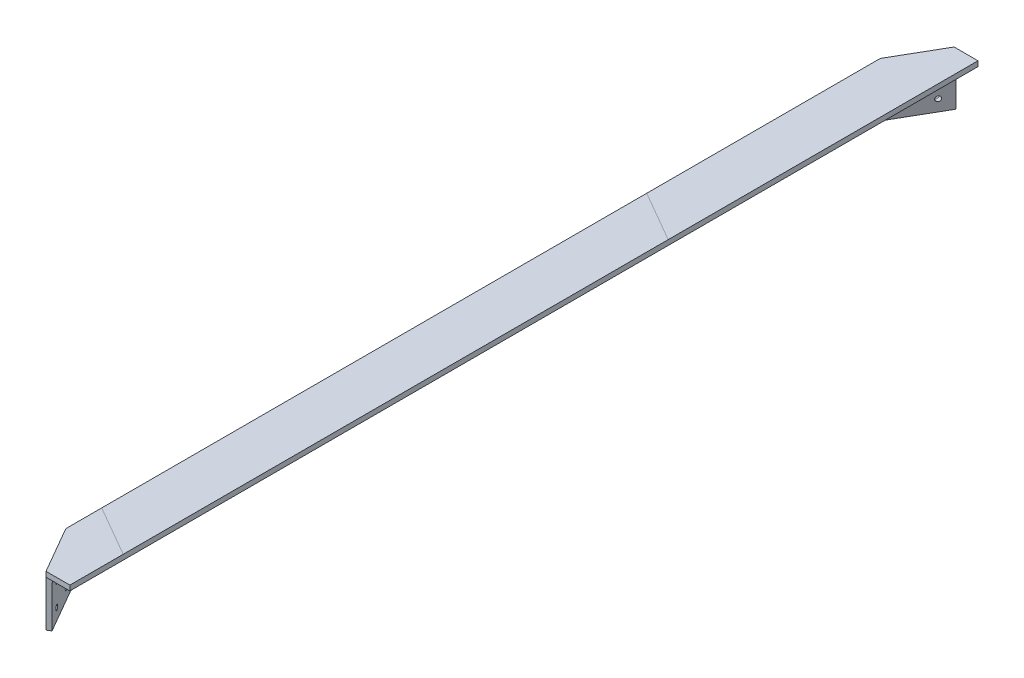
ISO-10303-21;
HEADER;
FILE_DESCRIPTION(('STEP AP214'),'2;1');
FILE_NAME('part.step','',(''),(''),'','','');
FILE_SCHEMA(('AUTOMOTIVE_DESIGN { 1 0 10303 214 1 1 1 1 }'));
ENDSEC;
DATA;
#1=APPLICATION_CONTEXT('core data for automotive mechanical design processes');
#2=APPLICATION_PROTOCOL_DEFINITION('international standard','automotive_design',2000,#1);
#3=PRODUCT_CONTEXT('',#1,'mechanical');
#4=PRODUCT('Part','Part','',(#3));
#5=PRODUCT_RELATED_PRODUCT_CATEGORY('part','',(#4));
#6=PRODUCT_DEFINITION_FORMATION('','',#4);
#7=PRODUCT_DEFINITION_CONTEXT('part definition',#1,'design');
#8=PRODUCT_DEFINITION('design','',#6,#7);
#9=PRODUCT_DEFINITION_SHAPE('','',#8);
#10=(LENGTH_UNIT() NAMED_UNIT(*) SI_UNIT(.MILLI.,.METRE.));
#11=(NAMED_UNIT(*) PLANE_ANGLE_UNIT() SI_UNIT($,.RADIAN.));
#12=(NAMED_UNIT(*) SI_UNIT($,.STERADIAN.) SOLID_ANGLE_UNIT());
#13=UNCERTAINTY_MEASURE_WITH_UNIT(LENGTH_MEASURE(1.E-05),#10,'distance_accuracy_value','');
#14=(GEOMETRIC_REPRESENTATION_CONTEXT(3) GLOBAL_UNCERTAINTY_ASSIGNED_CONTEXT((#13)) GLOBAL_UNIT_ASSIGNED_CONTEXT((#10,
#11,#12)) REPRESENTATION_CONTEXT('',''));
#15=CARTESIAN_POINT('',(0.,0.,0.));
#16=DIRECTION('',(0.,0.,1.));
#17=DIRECTION('',(1.,0.,0.));
#18=AXIS2_PLACEMENT_3D('',#15,#16,#17);
#19=CARTESIAN_POINT('',(-7.99999999999999,8.00000000000001,640.));
#20=DIRECTION('',(0.,-1.,0.));
#21=DIRECTION('',(1.,0.,0.));
#22=AXIS2_PLACEMENT_3D('',#19,#20,#21);
#23=PLANE('',#22);
#24=DIRECTION('',(-0.866025403784436,0.,-0.500000000000005));
#25=VECTOR('',#24,1.);
#26=CARTESIAN_POINT('',(387.319024505817,8.00000000000002,-44.7126356426317));
#27=LINE('',#26,#25);
#28=CARTESIAN_POINT('',(72.,8.00000000000001,-226.762159321677));
#29=VERTEX_POINT('',#28);
#30=CARTESIAN_POINT('',(-7.99999999999999,8.00000000000001,-272.950180856848));
#31=VERTEX_POINT('',#30);
#32=EDGE_CURVE('E11',#29,#31,#27,.T.);
#33=ORIENTED_EDGE('',*,*,#32,.F.);
#34=DIRECTION('',(0.,0.,-1.));
#35=VECTOR('',#34,1.);
#36=CARTESIAN_POINT('',(72.,8.00000000000001,640.));
#37=LINE('',#36,#35);
#38=CARTESIAN_POINT('',(72.,8.,-713.612159321677));
#39=VERTEX_POINT('',#38);
#40=EDGE_CURVE('E289',#29,#39,#37,.T.);
#41=ORIENTED_EDGE('',*,*,#40,.T.);
#42=DIRECTION('',(1.,0.,0.));
#43=VECTOR('',#42,1.);
#44=CARTESIAN_POINT('',(34.4999999999996,8.,-713.612159321677));
#45=LINE('',#44,#43);
#46=CARTESIAN_POINT('',(34.4999999999996,8.,-713.612159321677));
#47=VERTEX_POINT('',#46);
#48=EDGE_CURVE('E219',#47,#39,#45,.T.);
#49=ORIENTED_EDGE('',*,*,#48,.F.);
#50=DIRECTION('',(0.499999999999995,0.,-0.866025403784441));
#51=VECTOR('',#50,1.);
#52=CARTESIAN_POINT('',(-7.99999999999999,8.,-640.));
#53=LINE('',#52,#51);
#54=CARTESIAN_POINT('',(-6.66025403784448,8.,-642.320508075689));
#55=VERTEX_POINT('',#54);
#56=EDGE_CURVE('E222',#55,#47,#53,.T.);
#57=ORIENTED_EDGE('',*,*,#56,.F.);
#58=CARTESIAN_POINT('',(2.00000000000001,8.00000000000001,-637.320508075689));
#59=DIRECTION('',(0.,-1.,0.));
#60=DIRECTION('',(1.,0.,0.));
#61=AXIS2_PLACEMENT_3D('',#58,#59,#60);
#62=CIRCLE('',#61,10.);
#63=CARTESIAN_POINT('',(-7.99999999999999,8.00000000000001,-637.320508075689));
#64=VERTEX_POINT('',#63);
#65=EDGE_CURVE('E346',#55,#64,#62,.F.);
#66=ORIENTED_EDGE('',*,*,#65,.T.);
#67=DIRECTION('',(0.,0.,-1.));
#68=VECTOR('',#67,1.);
#69=CARTESIAN_POINT('',(-7.99999999999999,8.00000000000001,640.));
#70=LINE('',#69,#68);
#71=EDGE_CURVE('E285',#31,#64,#70,.T.);
#72=ORIENTED_EDGE('',*,*,#71,.F.);
#73=EDGE_LOOP('',(#33,#41,#49,#57,#66,#72));
#74=FACE_BOUND('',#73,.T.);
#75=ADVANCED_FACE('F43',(#74),#23,.F.);
#76=DIRECTION('',(0.866025403784436,0.,0.500000000000005));
#77=VECTOR('',#76,1.);
#78=CARTESIAN_POINT('',(16.4331150536629,8.00000000000001,597.68060333988));
#79=LINE('',#78,#77);
#80=CARTESIAN_POINT('',(-8.00000000000001,8.00000000000001,583.574137786507));
#81=VERTEX_POINT('',#80);
#82=CARTESIAN_POINT('',(72.,8.00000000000001,629.762159321678));
#83=VERTEX_POINT('',#82);
#84=EDGE_CURVE('E52',#81,#83,#79,.T.);
#85=ORIENTED_EDGE('',*,*,#84,.F.);
#86=CARTESIAN_POINT('',(-7.99999999999999,8.00000000000001,637.320508075689));
#87=VERTEX_POINT('',#86);
#88=EDGE_CURVE('E286',#87,#81,#70,.T.);
#89=ORIENTED_EDGE('',*,*,#88,.F.);
#90=CARTESIAN_POINT('',(2.00000000000001,8.00000000000001,637.320508075689));
#91=DIRECTION('',(0.,-1.,0.));
#92=DIRECTION('',(1.,0.,0.));
#93=AXIS2_PLACEMENT_3D('',#90,#91,#92);
#94=CIRCLE('',#93,10.);
#95=CARTESIAN_POINT('',(-6.66025403784442,8.,642.320508075689));
#96=VERTEX_POINT('',#95);
#97=EDGE_CURVE('E309',#87,#96,#94,.F.);
#98=ORIENTED_EDGE('',*,*,#97,.T.);
#99=DIRECTION('',(0.499999999999995,0.,0.866025403784441));
#100=VECTOR('',#99,1.);
#101=CARTESIAN_POINT('',(-7.99999999999999,8.,640.));
#102=LINE('',#101,#100);
#103=CARTESIAN_POINT('',(34.4999999999996,8.,713.612159321677));
#104=VERTEX_POINT('',#103);
#105=EDGE_CURVE('E272',#96,#104,#102,.T.);
#106=ORIENTED_EDGE('',*,*,#105,.T.);
#107=DIRECTION('',(1.,0.,0.));
#108=VECTOR('',#107,1.);
#109=CARTESIAN_POINT('',(34.4999999999996,8.,713.612159321677));
#110=LINE('',#109,#108);
#111=CARTESIAN_POINT('',(72.,8.,713.612159321677));
#112=VERTEX_POINT('',#111);
#113=EDGE_CURVE('E274',#104,#112,#110,.T.);
#114=ORIENTED_EDGE('',*,*,#113,.T.);
#115=EDGE_CURVE('E291',#112,#83,#37,.T.);
#116=ORIENTED_EDGE('',*,*,#115,.T.);
#117=EDGE_LOOP('',(#85,#89,#98,#106,#114,#116));
#118=FACE_BOUND('',#117,.T.);
#119=ADVANCED_FACE('F431',(#118),#23,.F.);
#120=CARTESIAN_POINT('',(72.,0.,640.));
#121=DIRECTION('',(0.,1.,0.));
#122=DIRECTION('',(-1.,0.,0.));
#123=AXIS2_PLACEMENT_3D('',#120,#121,#122);
#124=PLANE('',#123);
#125=DIRECTION('',(0.,0.,-1.));
#126=VECTOR('',#125,1.);
#127=CARTESIAN_POINT('',(8.00000000000001,0.,0.));
#128=LINE('',#127,#126);
#129=CARTESIAN_POINT('',(8.,0.,637.320508075689));
#130=VERTEX_POINT('',#129);
#131=CARTESIAN_POINT('',(8.00000000000001,0.,0.));
#132=VERTEX_POINT('',#131);
#133=EDGE_CURVE('E322',#130,#132,#128,.T.);
#134=ORIENTED_EDGE('',*,*,#133,.T.);
#135=DIRECTION('',(0.,0.,1.));
#136=VECTOR('',#135,1.);
#137=CARTESIAN_POINT('',(8.,0.,-637.320508075689));
#138=LINE('',#137,#136);
#139=CARTESIAN_POINT('',(8.,0.,-637.320508075689));
#140=VERTEX_POINT('',#139);
#141=EDGE_CURVE('E364',#132,#140,#138,.F.);
#142=ORIENTED_EDGE('',*,*,#141,.T.);
#143=CARTESIAN_POINT('',(10.,0.,-637.320508075689));
#144=DIRECTION('',(0.,1.,0.));
#145=DIRECTION('',(-1.,0.,0.));
#146=AXIS2_PLACEMENT_3D('',#143,#144,#145);
#147=CIRCLE('',#146,2.);
#148=CARTESIAN_POINT('',(8.26794919243096,0.,-638.320508075689));
#149=VERTEX_POINT('',#148);
#150=EDGE_CURVE('E362',#140,#149,#147,.F.);
#151=ORIENTED_EDGE('',*,*,#150,.T.);
#152=DIRECTION('',(0.499999999999996,0.,-0.866025403784441));
#153=VECTOR('',#152,1.);
#154=CARTESIAN_POINT('',(-529.328055191762,0.,292.823085463766));
#155=LINE('',#154,#153);
#156=CARTESIAN_POINT('',(47.4282032302751,0.,-706.14805770654));
#157=VERTEX_POINT('',#156);
#158=EDGE_CURVE('E359',#149,#157,#155,.T.);
#159=ORIENTED_EDGE('',*,*,#158,.T.);
#160=DIRECTION('',(-0.866025403784439,0.,-0.5));
#161=VECTOR('',#160,1.);
#162=CARTESIAN_POINT('',(34.4999999999996,0.,-713.612159321677));
#163=LINE('',#162,#161);
#164=CARTESIAN_POINT('',(34.4999999999996,0.,-713.612159321677));
#165=VERTEX_POINT('',#164);
#166=EDGE_CURVE('E206',#157,#165,#163,.T.);
#167=ORIENTED_EDGE('',*,*,#166,.T.);
#168=DIRECTION('',(1.,0.,0.));
#169=VECTOR('',#168,1.);
#170=CARTESIAN_POINT('',(34.4999999999996,0.,-713.612159321677));
#171=LINE('',#170,#169);
#172=CARTESIAN_POINT('',(72.,0.,-713.612159321677));
#173=VERTEX_POINT('',#172);
#174=EDGE_CURVE('E196',#165,#173,#171,.T.);
#175=ORIENTED_EDGE('',*,*,#174,.T.);
#176=DIRECTION('',(0.,0.,-1.));
#177=VECTOR('',#176,1.);
#178=CARTESIAN_POINT('',(72.,0.,640.));
#179=LINE('',#178,#177);
#180=CARTESIAN_POINT('',(72.,0.,713.612159321677));
#181=VERTEX_POINT('',#180);
#182=EDGE_CURVE('E294',#181,#173,#179,.T.);
#183=ORIENTED_EDGE('',*,*,#182,.F.);
#184=DIRECTION('',(1.,0.,0.));
#185=VECTOR('',#184,1.);
#186=CARTESIAN_POINT('',(34.4999999999996,0.,713.612159321677));
#187=LINE('',#186,#185);
#188=CARTESIAN_POINT('',(34.4999999999996,0.,713.612159321677));
#189=VERTEX_POINT('',#188);
#190=EDGE_CURVE('E271',#189,#181,#187,.T.);
#191=ORIENTED_EDGE('',*,*,#190,.F.);
#192=DIRECTION('',(-0.866025403784439,0.,0.5));
#193=VECTOR('',#192,1.);
#194=CARTESIAN_POINT('',(34.4999999999996,0.,713.612159321677));
#195=LINE('',#194,#193);
#196=CARTESIAN_POINT('',(47.4282032302752,0.,706.14805770654));
#197=VERTEX_POINT('',#196);
#198=EDGE_CURVE('E256',#197,#189,#195,.T.);
#199=ORIENTED_EDGE('',*,*,#198,.F.);
#200=DIRECTION('',(0.499999999999996,0.,0.866025403784441));
#201=VECTOR('',#200,1.);
#202=CARTESIAN_POINT('',(8.26794919243111,0.,638.320508075689));
#203=LINE('',#202,#201);
#204=CARTESIAN_POINT('',(8.26794919243111,0.,638.320508075689));
#205=VERTEX_POINT('',#204);
#206=EDGE_CURVE('E318',#197,#205,#203,.F.);
#207=ORIENTED_EDGE('',*,*,#206,.T.);
#208=CARTESIAN_POINT('',(10.,0.,637.320508075689));
#209=DIRECTION('',(0.,1.,0.));
#210=DIRECTION('',(-1.,0.,0.));
#211=AXIS2_PLACEMENT_3D('',#208,#209,#210);
#212=CIRCLE('',#211,2.);
#213=EDGE_CURVE('E320',#205,#130,#212,.F.);
#214=ORIENTED_EDGE('',*,*,#213,.T.);
#215=EDGE_LOOP('',(#134,#142,#151,#159,#167,#175,#183,#191,#199,#207,#214));
#216=FACE_BOUND('',#215,.T.);
#217=ADVANCED_FACE('F438',(#216),#124,.F.);
#218=CARTESIAN_POINT('',(-8.,-72.,640.));
#219=DIRECTION('',(1.,0.,0.));
#220=DIRECTION('',(0.,1.,0.));
#221=AXIS2_PLACEMENT_3D('',#218,#219,#220);
#222=PLANE('',#221);
#223=ORIENTED_EDGE('',*,*,#88,.T.);
#224=EDGE_CURVE('E290',#81,#31,#70,.T.);
#225=ORIENTED_EDGE('',*,*,#224,.T.);
#226=ORIENTED_EDGE('',*,*,#71,.T.);
#227=DIRECTION('',(0.,-1.,0.));
#228=VECTOR('',#227,1.);
#229=CARTESIAN_POINT('',(-8.,-72.,-637.320508075689));
#230=LINE('',#229,#228);
#231=CARTESIAN_POINT('',(-8.,-72.,-637.320508075689));
#232=VERTEX_POINT('',#231);
#233=EDGE_CURVE('E336',#64,#232,#230,.T.);
#234=ORIENTED_EDGE('',*,*,#233,.T.);
#235=DIRECTION('',(0.,0.,-1.));
#236=VECTOR('',#235,1.);
#237=CARTESIAN_POINT('',(-8.,-72.,640.));
#238=LINE('',#237,#236);
#239=CARTESIAN_POINT('',(-8.,-72.,637.320508075689));
#240=VERTEX_POINT('',#239);
#241=EDGE_CURVE('E300',#240,#232,#238,.T.);
#242=ORIENTED_EDGE('',*,*,#241,.F.);
#243=DIRECTION('',(0.,-1.,0.));
#244=VECTOR('',#243,1.);
#245=CARTESIAN_POINT('',(-8.,-72.,637.320508075689));
#246=LINE('',#245,#244);
#247=EDGE_CURVE('E307',#240,#87,#246,.F.);
#248=ORIENTED_EDGE('',*,*,#247,.T.);
#249=EDGE_LOOP('',(#223,#225,#226,#234,#242,#248));
#250=FACE_BOUND('',#249,.T.);
#251=ADVANCED_FACE('F514',(#250),#222,.F.);
#252=CARTESIAN_POINT('',(0.,-72.,640.));
#253=DIRECTION('',(0.,1.,0.));
#254=DIRECTION('',(0.,0.,1.));
#255=AXIS2_PLACEMENT_3D('',#252,#253,#254);
#256=PLANE('',#255);
#257=ORIENTED_EDGE('',*,*,#241,.T.);
#258=CARTESIAN_POINT('',(2.,-72.,-637.320508075689));
#259=DIRECTION('',(0.,1.,0.));
#260=DIRECTION('',(0.,0.,1.));
#261=AXIS2_PLACEMENT_3D('',#258,#259,#260);
#262=CIRCLE('',#261,10.);
#263=CARTESIAN_POINT('',(-6.66025403784449,-72.,-642.320508075689));
#264=VERTEX_POINT('',#263);
#265=EDGE_CURVE('E205',#232,#264,#262,.F.);
#266=ORIENTED_EDGE('',*,*,#265,.T.);
#267=DIRECTION('',(-0.499999999999996,0.,0.866025403784441));
#268=VECTOR('',#267,1.);
#269=CARTESIAN_POINT('',(-8.,-72.,-640.));
#270=LINE('',#269,#268);
#271=CARTESIAN_POINT('',(34.4999999999996,-72.,-713.612159321677));
#272=VERTEX_POINT('',#271);
#273=EDGE_CURVE('E189',#272,#264,#270,.T.);
#274=ORIENTED_EDGE('',*,*,#273,.F.);
#275=DIRECTION('',(-0.866025403784439,0.,-0.5));
#276=VECTOR('',#275,1.);
#277=CARTESIAN_POINT('',(34.4999999999996,-72.,-713.612159321677));
#278=LINE('',#277,#276);
#279=CARTESIAN_POINT('',(40.4999999999997,-72.,-710.14805770654));
#280=VERTEX_POINT('',#279);
#281=EDGE_CURVE('E204',#280,#272,#278,.T.);
#282=ORIENTED_EDGE('',*,*,#281,.F.);
#283=DIRECTION('',(0.499999999999996,0.,-0.866025403784441));
#284=VECTOR('',#283,1.);
#285=CARTESIAN_POINT('',(40.4999999999997,-72.,-710.14805770654));
#286=LINE('',#285,#284);
#287=CARTESIAN_POINT('',(1.33974596215551,-72.,-642.320508075689));
#288=VERTEX_POINT('',#287);
#289=EDGE_CURVE('E211',#288,#280,#286,.T.);
#290=ORIENTED_EDGE('',*,*,#289,.F.);
#291=CARTESIAN_POINT('',(10.,-72.,-637.320508075689));
#292=DIRECTION('',(0.,1.,0.));
#293=DIRECTION('',(0.,0.,1.));
#294=AXIS2_PLACEMENT_3D('',#291,#292,#293);
#295=CIRCLE('',#294,10.);
#296=CARTESIAN_POINT('',(0.,-72.,-637.320508075689));
#297=VERTEX_POINT('',#296);
#298=EDGE_CURVE('E354',#288,#297,#295,.T.);
#299=ORIENTED_EDGE('',*,*,#298,.T.);
#300=DIRECTION('',(0.,0.,-1.));
#301=VECTOR('',#300,1.);
#302=CARTESIAN_POINT('',(0.,-72.,640.));
#303=LINE('',#302,#301);
#304=CARTESIAN_POINT('',(0.,-72.,637.320508075689));
#305=VERTEX_POINT('',#304);
#306=EDGE_CURVE('E297',#305,#297,#303,.T.);
#307=ORIENTED_EDGE('',*,*,#306,.F.);
#308=CARTESIAN_POINT('',(10.,-72.,637.320508075689));
#309=DIRECTION('',(0.,1.,0.));
#310=DIRECTION('',(0.,0.,1.));
#311=AXIS2_PLACEMENT_3D('',#308,#309,#310);
#312=CIRCLE('',#311,10.);
#313=CARTESIAN_POINT('',(1.33974596215557,-72.,642.320508075689));
#314=VERTEX_POINT('',#313);
#315=EDGE_CURVE('E316',#305,#314,#312,.T.);
#316=ORIENTED_EDGE('',*,*,#315,.T.);
#317=DIRECTION('',(0.499999999999996,0.,0.866025403784441));
#318=VECTOR('',#317,1.);
#319=CARTESIAN_POINT('',(40.4999999999997,-72.,710.14805770654));
#320=LINE('',#319,#318);
#321=CARTESIAN_POINT('',(40.4999999999997,-72.,710.14805770654));
#322=VERTEX_POINT('',#321);
#323=EDGE_CURVE('E257',#314,#322,#320,.T.);
#324=ORIENTED_EDGE('',*,*,#323,.T.);
#325=DIRECTION('',(-0.866025403784439,0.,0.5));
#326=VECTOR('',#325,1.);
#327=CARTESIAN_POINT('',(34.4999999999996,-72.,713.612159321677));
#328=LINE('',#327,#326);
#329=CARTESIAN_POINT('',(34.4999999999996,-72.,713.612159321677));
#330=VERTEX_POINT('',#329);
#331=EDGE_CURVE('E259',#322,#330,#328,.T.);
#332=ORIENTED_EDGE('',*,*,#331,.T.);
#333=DIRECTION('',(-0.499999999999996,0.,-0.866025403784441));
#334=VECTOR('',#333,1.);
#335=CARTESIAN_POINT('',(-8.,-72.,640.));
#336=LINE('',#335,#334);
#337=CARTESIAN_POINT('',(-6.66025403784442,-72.,642.320508075689));
#338=VERTEX_POINT('',#337);
#339=EDGE_CURVE('E261',#330,#338,#336,.T.);
#340=ORIENTED_EDGE('',*,*,#339,.T.);
#341=CARTESIAN_POINT('',(2.,-72.,637.320508075689));
#342=DIRECTION('',(0.,1.,0.));
#343=DIRECTION('',(0.,0.,1.));
#344=AXIS2_PLACEMENT_3D('',#341,#342,#343);
#345=CIRCLE('',#344,10.);
#346=EDGE_CURVE('E305',#338,#240,#345,.F.);
#347=ORIENTED_EDGE('',*,*,#346,.T.);
#348=EDGE_LOOP('',(#257,#266,#274,#282,#290,#299,#307,#316,#324,#332,#340,#347));
#349=FACE_BOUND('',#348,.T.);
#350=ADVANCED_FACE('F202',(#349),#256,.F.);
#351=CARTESIAN_POINT('',(0.,0.,640.));
#352=DIRECTION('',(-1.,0.,0.));
#353=DIRECTION('',(0.,-1.,0.));
#354=AXIS2_PLACEMENT_3D('',#351,#352,#353);
#355=PLANE('',#354);
#356=DIRECTION('',(0.,1.,0.));
#357=VECTOR('',#356,1.);
#358=CARTESIAN_POINT('',(0.,0.,-637.320508075689));
#359=LINE('',#358,#357);
#360=CARTESIAN_POINT('',(0.,-8.,-637.320508075689));
#361=VERTEX_POINT('',#360);
#362=EDGE_CURVE('E349',#297,#361,#359,.T.);
#363=ORIENTED_EDGE('',*,*,#362,.T.);
#364=DIRECTION('',(0.,0.,1.));
#365=VECTOR('',#364,1.);
#366=CARTESIAN_POINT('',(0.,-8.,0.));
#367=LINE('',#366,#365);
#368=CARTESIAN_POINT('',(0.,-8.,0.));
#369=VERTEX_POINT('',#368);
#370=EDGE_CURVE('E356',#361,#369,#367,.T.);
#371=ORIENTED_EDGE('',*,*,#370,.T.);
#372=DIRECTION('',(0.,0.,-1.));
#373=VECTOR('',#372,1.);
#374=CARTESIAN_POINT('',(0.,-8.,637.320508075689));
#375=LINE('',#374,#373);
#376=CARTESIAN_POINT('',(0.,-8.00000000000001,637.320508075689));
#377=VERTEX_POINT('',#376);
#378=EDGE_CURVE('E325',#369,#377,#375,.F.);
#379=ORIENTED_EDGE('',*,*,#378,.T.);
#380=DIRECTION('',(0.,1.,0.));
#381=VECTOR('',#380,1.);
#382=CARTESIAN_POINT('',(0.,-72.,637.320508075689));
#383=LINE('',#382,#381);
#384=EDGE_CURVE('E314',#377,#305,#383,.F.);
#385=ORIENTED_EDGE('',*,*,#384,.T.);
#386=ORIENTED_EDGE('',*,*,#306,.T.);
#387=EDGE_LOOP('',(#363,#371,#379,#385,#386));
#388=FACE_BOUND('',#387,.T.);
#389=ADVANCED_FACE('F451',(#388),#355,.F.);
#390=CARTESIAN_POINT('',(72.,8.00000000000001,640.));
#391=DIRECTION('',(-1.,0.,0.));
#392=DIRECTION('',(0.,0.,1.));
#393=AXIS2_PLACEMENT_3D('',#390,#391,#392);
#394=PLANE('',#393);
#395=ORIENTED_EDGE('',*,*,#182,.T.);
#396=DIRECTION('',(0.,-1.,0.));
#397=VECTOR('',#396,1.);
#398=CARTESIAN_POINT('',(72.,8.,-713.612159321677));
#399=LINE('',#398,#397);
#400=EDGE_CURVE('E227',#39,#173,#399,.T.);
#401=ORIENTED_EDGE('',*,*,#400,.F.);
#402=ORIENTED_EDGE('',*,*,#40,.F.);
#403=EDGE_CURVE('E295',#83,#29,#37,.T.);
#404=ORIENTED_EDGE('',*,*,#403,.F.);
#405=ORIENTED_EDGE('',*,*,#115,.F.);
#406=DIRECTION('',(0.,-1.,0.));
#407=VECTOR('',#406,1.);
#408=CARTESIAN_POINT('',(72.,8.,713.612159321677));
#409=LINE('',#408,#407);
#410=EDGE_CURVE('E277',#112,#181,#409,.T.);
#411=ORIENTED_EDGE('',*,*,#410,.T.);
#412=EDGE_LOOP('',(#395,#401,#402,#404,#405,#411));
#413=FACE_BOUND('',#412,.T.);
#414=ADVANCED_FACE('F444',(#413),#394,.F.);
#415=ORIENTED_EDGE('',*,*,#403,.T.);
#416=ORIENTED_EDGE('',*,*,#32,.T.);
#417=ORIENTED_EDGE('',*,*,#224,.F.);
#418=ORIENTED_EDGE('',*,*,#84,.T.);
#419=EDGE_LOOP('',(#415,#416,#417,#418));
#420=FACE_BOUND('',#419,.T.);
#421=ADVANCED_FACE('F433',(#420),#23,.F.);
#422=CARTESIAN_POINT('',(-7.99999999999999,8.,640.));
#423=DIRECTION('',(0.866025403784441,0.,-0.499999999999995));
#424=DIRECTION('',(-0.499999999999995,0.,-0.866025403784441));
#425=AXIS2_PLACEMENT_3D('',#422,#423,#424);
#426=PLANE('',#425);
#427=CARTESIAN_POINT('',(24.3749999999998,-54.,696.075144895043));
#428=DIRECTION('',(0.866025403784441,0.,-0.499999999999995));
#429=DIRECTION('',(-0.499999999999995,0.,-0.866025403784441));
#430=AXIS2_PLACEMENT_3D('',#427,#428,#429);
#431=CIRCLE('',#430,4.00000000000006);
#432=CARTESIAN_POINT('',(22.3749999999998,-54.,692.611043279905));
#433=VERTEX_POINT('',#432);
#434=EDGE_CURVE('E253',#433,#433,#431,.T.);
#435=ORIENTED_EDGE('',*,*,#434,.T.);
#436=EDGE_LOOP('',(#435));
#437=FACE_BOUND('',#436,.T.);
#438=CARTESIAN_POINT('',(4.12499999999999,-54.,661.001116041773));
#439=DIRECTION('',(0.866025403784441,0.,-0.499999999999995));
#440=DIRECTION('',(-0.499999999999995,0.,-0.866025403784441));
#441=AXIS2_PLACEMENT_3D('',#438,#439,#440);
#442=CIRCLE('',#441,3.99999999999997);
#443=CARTESIAN_POINT('',(2.12500000000002,-54.,657.537014426635));
#444=VERTEX_POINT('',#443);
#445=EDGE_CURVE('E250',#444,#444,#442,.T.);
#446=ORIENTED_EDGE('',*,*,#445,.T.);
#447=EDGE_LOOP('',(#446));
#448=FACE_BOUND('',#447,.T.);
#449=CARTESIAN_POINT('',(4.12499999999999,-18.,661.001116041773));
#450=DIRECTION('',(0.866025403784441,0.,-0.499999999999995));
#451=DIRECTION('',(-0.499999999999995,0.,-0.866025403784441));
#452=AXIS2_PLACEMENT_3D('',#449,#450,#451);
#453=CIRCLE('',#452,3.99999999999997);
#454=CARTESIAN_POINT('',(2.12500000000002,-18.,657.537014426635));
#455=VERTEX_POINT('',#454);
#456=EDGE_CURVE('E247',#455,#455,#453,.T.);
#457=ORIENTED_EDGE('',*,*,#456,.T.);
#458=EDGE_LOOP('',(#457));
#459=FACE_BOUND('',#458,.T.);
#460=CARTESIAN_POINT('',(24.3749999999998,-18.,696.075144895043));
#461=DIRECTION('',(0.866025403784441,0.,-0.499999999999995));
#462=DIRECTION('',(-0.499999999999995,0.,-0.866025403784441));
#463=AXIS2_PLACEMENT_3D('',#460,#461,#462);
#464=CIRCLE('',#463,4.00000000000006);
#465=CARTESIAN_POINT('',(22.3749999999998,-18.,692.611043279905));
#466=VERTEX_POINT('',#465);
#467=EDGE_CURVE('E244',#466,#466,#464,.T.);
#468=ORIENTED_EDGE('',*,*,#467,.T.);
#469=EDGE_LOOP('',(#468));
#470=FACE_BOUND('',#469,.T.);
#471=ORIENTED_EDGE('',*,*,#105,.F.);
#472=DIRECTION('',(0.,-1.,0.));
#473=VECTOR('',#472,1.);
#474=CARTESIAN_POINT('',(-6.66025403784442,8.,642.320508075689));
#475=LINE('',#474,#473);
#476=EDGE_CURVE('E302',#96,#338,#475,.T.);
#477=ORIENTED_EDGE('',*,*,#476,.T.);
#478=ORIENTED_EDGE('',*,*,#339,.F.);
#479=DIRECTION('',(0.,1.,0.));
#480=VECTOR('',#479,1.);
#481=CARTESIAN_POINT('',(34.4999999999996,-72.,713.612159321677));
#482=LINE('',#481,#480);
#483=EDGE_CURVE('E264',#330,#189,#482,.T.);
#484=ORIENTED_EDGE('',*,*,#483,.T.);
#485=DIRECTION('',(0.,-1.,0.));
#486=VECTOR('',#485,1.);
#487=CARTESIAN_POINT('',(34.4999999999996,8.,713.612159321677));
#488=LINE('',#487,#486);
#489=EDGE_CURVE('E282',#104,#189,#488,.T.);
#490=ORIENTED_EDGE('',*,*,#489,.F.);
#491=EDGE_LOOP('',(#471,#477,#478,#484,#490));
#492=FACE_BOUND('',#491,.T.);
#493=ADVANCED_FACE('F443',(#437,#448,#459,#470,#492),#426,.F.);
#494=CARTESIAN_POINT('',(34.4999999999996,8.,713.612159321677));
#495=DIRECTION('',(0.,0.,-1.));
#496=DIRECTION('',(-1.,0.,0.));
#497=AXIS2_PLACEMENT_3D('',#494,#495,#496);
#498=PLANE('',#497);
#499=ORIENTED_EDGE('',*,*,#190,.T.);
#500=ORIENTED_EDGE('',*,*,#410,.F.);
#501=ORIENTED_EDGE('',*,*,#113,.F.);
#502=ORIENTED_EDGE('',*,*,#489,.T.);
#503=EDGE_LOOP('',(#499,#500,#501,#502));
#504=FACE_BOUND('',#503,.T.);
#505=ADVANCED_FACE('F449',(#504),#498,.F.);
#506=CARTESIAN_POINT('',(40.4999999999997,-72.,710.14805770654));
#507=DIRECTION('',(-0.866025403784441,0.,0.499999999999996));
#508=DIRECTION('',(0.499999999999996,0.,0.866025403784441));
#509=AXIS2_PLACEMENT_3D('',#506,#507,#508);
#510=PLANE('',#509);
#511=CARTESIAN_POINT('',(30.3749999999997,-54.,692.611043279905));
#512=DIRECTION('',(0.866025403784441,0.,-0.499999999999996));
#513=DIRECTION('',(0.499999999999996,0.,0.866025403784441));
#514=AXIS2_PLACEMENT_3D('',#511,#512,#513);
#515=CIRCLE('',#514,4.00000000000006);
#516=CARTESIAN_POINT('',(32.3749999999997,-54.,696.075144895043));
#517=VERTEX_POINT('',#516);
#518=EDGE_CURVE('E238',#517,#517,#515,.T.);
#519=ORIENTED_EDGE('',*,*,#518,.F.);
#520=EDGE_LOOP('',(#519));
#521=FACE_BOUND('',#520,.T.);
#522=CARTESIAN_POINT('',(10.1249999999999,-54.,657.537014426635));
#523=DIRECTION('',(0.866025403784441,0.,-0.499999999999996));
#524=DIRECTION('',(-0.499999999999996,0.,-0.866025403784441));
#525=AXIS2_PLACEMENT_3D('',#522,#523,#524);
#526=CIRCLE('',#525,3.99999999999997);
#527=CARTESIAN_POINT('',(8.12499999999997,-54.,654.072912811497));
#528=VERTEX_POINT('',#527);
#529=EDGE_CURVE('E235',#528,#528,#526,.T.);
#530=ORIENTED_EDGE('',*,*,#529,.F.);
#531=EDGE_LOOP('',(#530));
#532=FACE_BOUND('',#531,.T.);
#533=CARTESIAN_POINT('',(10.1249999999999,-18.,657.537014426635));
#534=DIRECTION('',(0.866025403784441,0.,-0.499999999999996));
#535=DIRECTION('',(0.499999999999996,0.,0.866025403784441));
#536=AXIS2_PLACEMENT_3D('',#533,#534,#535);
#537=CIRCLE('',#536,3.99999999999997);
#538=CARTESIAN_POINT('',(12.1249999999999,-18.,661.001116041773));
#539=VERTEX_POINT('',#538);
#540=EDGE_CURVE('E231',#539,#539,#537,.T.);
#541=ORIENTED_EDGE('',*,*,#540,.F.);
#542=EDGE_LOOP('',(#541));
#543=FACE_BOUND('',#542,.T.);
#544=CARTESIAN_POINT('',(30.3749999999997,-18.,692.611043279905));
#545=DIRECTION('',(0.866025403784441,0.,-0.499999999999996));
#546=DIRECTION('',(-0.499999999999996,0.,-0.866025403784441));
#547=AXIS2_PLACEMENT_3D('',#544,#545,#546);
#548=CIRCLE('',#547,4.00000000000006);
#549=CARTESIAN_POINT('',(28.3749999999997,-18.,689.146941664767));
#550=VERTEX_POINT('',#549);
#551=EDGE_CURVE('E234',#550,#550,#548,.T.);
#552=ORIENTED_EDGE('',*,*,#551,.F.);
#553=EDGE_LOOP('',(#552));
#554=FACE_BOUND('',#553,.T.);
#555=DIRECTION('',(0.,1.,0.));
#556=VECTOR('',#555,1.);
#557=CARTESIAN_POINT('',(1.33974596215556,0.,642.320508075689));
#558=LINE('',#557,#556);
#559=CARTESIAN_POINT('',(1.33974596215556,-8.,642.320508075689));
#560=VERTEX_POINT('',#559);
#561=EDGE_CURVE('E311',#314,#560,#558,.T.);
#562=ORIENTED_EDGE('',*,*,#561,.T.);
#563=DIRECTION('',(0.499999999999996,0.,0.866025403784441));
#564=VECTOR('',#563,1.);
#565=CARTESIAN_POINT('',(40.4999999999996,-7.99999999999999,710.14805770654));
#566=LINE('',#565,#564);
#567=CARTESIAN_POINT('',(40.4999999999997,-7.99999999999999,710.14805770654));
#568=VERTEX_POINT('',#567);
#569=EDGE_CURVE('E329',#560,#568,#566,.T.);
#570=ORIENTED_EDGE('',*,*,#569,.T.);
#571=DIRECTION('',(0.,1.,0.));
#572=VECTOR('',#571,1.);
#573=CARTESIAN_POINT('',(40.4999999999997,-72.,710.14805770654));
#574=LINE('',#573,#572);
#575=EDGE_CURVE('E268',#322,#568,#574,.T.);
#576=ORIENTED_EDGE('',*,*,#575,.F.);
#577=ORIENTED_EDGE('',*,*,#323,.F.);
#578=EDGE_LOOP('',(#562,#570,#576,#577));
#579=FACE_BOUND('',#578,.T.);
#580=ADVANCED_FACE('F485',(#521,#532,#543,#554,#579),#510,.F.);
#581=CARTESIAN_POINT('',(34.4999999999996,-72.,713.612159321677));
#582=DIRECTION('',(-0.5,0.,-0.866025403784439));
#583=DIRECTION('',(-0.866025403784439,0.,0.5));
#584=AXIS2_PLACEMENT_3D('',#581,#582,#583);
#585=PLANE('',#584);
#586=ORIENTED_EDGE('',*,*,#198,.T.);
#587=ORIENTED_EDGE('',*,*,#483,.F.);
#588=ORIENTED_EDGE('',*,*,#331,.F.);
#589=ORIENTED_EDGE('',*,*,#575,.T.);
#590=CARTESIAN_POINT('',(47.4282032302752,-7.99999999999999,706.14805770654));
#591=DIRECTION('',(-0.5,0.,-0.866025403784439));
#592=DIRECTION('',(-0.866025403784439,0.,0.5));
#593=AXIS2_PLACEMENT_3D('',#590,#591,#592);
#594=CIRCLE('',#593,8.);
#595=EDGE_CURVE('E333',#568,#197,#594,.T.);
#596=ORIENTED_EDGE('',*,*,#595,.T.);
#597=EDGE_LOOP('',(#586,#587,#588,#589,#596));
#598=FACE_BOUND('',#597,.T.);
#599=ADVANCED_FACE('F500',(#598),#585,.F.);
#600=CARTESIAN_POINT('',(23.4467967697242,-18.,696.611043279905));
#601=DIRECTION('',(0.866025403784441,0.,-0.499999999999996));
#602=DIRECTION('',(-0.499999999999996,0.,-0.866025403784441));
#603=AXIS2_PLACEMENT_3D('',#600,#601,#602);
#604=CYLINDRICAL_SURFACE('',#603,4.00000000000006);
#605=ORIENTED_EDGE('',*,*,#551,.T.);
#606=EDGE_LOOP('',(#605));
#607=FACE_BOUND('',#606,.T.);
#608=ORIENTED_EDGE('',*,*,#467,.F.);
#609=EDGE_LOOP('',(#608));
#610=FACE_BOUND('',#609,.T.);
#611=ADVANCED_FACE('F532',(#607,#610),#604,.F.);
#612=CARTESIAN_POINT('',(3.19679676972441,-18.,661.537014426635));
#613=DIRECTION('',(0.866025403784441,0.,-0.499999999999996));
#614=DIRECTION('',(-0.499999999999996,0.,-0.866025403784441));
#615=AXIS2_PLACEMENT_3D('',#612,#613,#614);
#616=CYLINDRICAL_SURFACE('',#615,3.99999999999997);
#617=ORIENTED_EDGE('',*,*,#540,.T.);
#618=EDGE_LOOP('',(#617));
#619=FACE_BOUND('',#618,.T.);
#620=ORIENTED_EDGE('',*,*,#456,.F.);
#621=EDGE_LOOP('',(#620));
#622=FACE_BOUND('',#621,.T.);
#623=ADVANCED_FACE('F534',(#619,#622),#616,.F.);
#624=CARTESIAN_POINT('',(3.19679676972441,-54.,661.537014426635));
#625=DIRECTION('',(0.866025403784441,0.,-0.499999999999996));
#626=DIRECTION('',(-0.499999999999996,0.,-0.866025403784441));
#627=AXIS2_PLACEMENT_3D('',#624,#625,#626);
#628=CYLINDRICAL_SURFACE('',#627,3.99999999999997);
#629=ORIENTED_EDGE('',*,*,#529,.T.);
#630=EDGE_LOOP('',(#629));
#631=FACE_BOUND('',#630,.T.);
#632=ORIENTED_EDGE('',*,*,#445,.F.);
#633=EDGE_LOOP('',(#632));
#634=FACE_BOUND('',#633,.T.);
#635=ADVANCED_FACE('F539',(#631,#634),#628,.F.);
#636=CARTESIAN_POINT('',(23.4467967697242,-54.,696.611043279905));
#637=DIRECTION('',(0.866025403784441,0.,-0.499999999999996));
#638=DIRECTION('',(-0.499999999999996,0.,-0.866025403784441));
#639=AXIS2_PLACEMENT_3D('',#636,#637,#638);
#640=CYLINDRICAL_SURFACE('',#639,4.00000000000006);
#641=ORIENTED_EDGE('',*,*,#518,.T.);
#642=EDGE_LOOP('',(#641));
#643=FACE_BOUND('',#642,.T.);
#644=ORIENTED_EDGE('',*,*,#434,.F.);
#645=EDGE_LOOP('',(#644));
#646=FACE_BOUND('',#645,.T.);
#647=ADVANCED_FACE('F536',(#643,#646),#640,.F.);
#648=CARTESIAN_POINT('',(2.00000000000001,8.,637.320508075689));
#649=DIRECTION('',(0.,-1.,0.));
#650=DIRECTION('',(0.,0.,-1.));
#651=AXIS2_PLACEMENT_3D('',#648,#649,#650);
#652=CYLINDRICAL_SURFACE('',#651,10.);
#653=ORIENTED_EDGE('',*,*,#97,.F.);
#654=ORIENTED_EDGE('',*,*,#247,.F.);
#655=ORIENTED_EDGE('',*,*,#346,.F.);
#656=ORIENTED_EDGE('',*,*,#476,.F.);
#657=EDGE_LOOP('',(#653,#654,#655,#656));
#658=FACE_BOUND('',#657,.T.);
#659=ADVANCED_FACE('F510',(#658),#652,.T.);
#660=CARTESIAN_POINT('',(10.,-72.,637.320508075689));
#661=DIRECTION('',(0.,-1.,0.));
#662=DIRECTION('',(1.,0.,0.));
#663=AXIS2_PLACEMENT_3D('',#660,#661,#662);
#664=CYLINDRICAL_SURFACE('',#663,10.);
#665=ORIENTED_EDGE('',*,*,#384,.F.);
#666=CARTESIAN_POINT('',(10.,-8.00000000000001,637.320508075689));
#667=DIRECTION('',(0.,1.,0.));
#668=DIRECTION('',(-1.,0.,0.));
#669=AXIS2_PLACEMENT_3D('',#666,#667,#668);
#670=CIRCLE('',#669,10.);
#671=EDGE_CURVE('E327',#377,#560,#670,.T.);
#672=ORIENTED_EDGE('',*,*,#671,.T.);
#673=ORIENTED_EDGE('',*,*,#561,.F.);
#674=ORIENTED_EDGE('',*,*,#315,.F.);
#675=EDGE_LOOP('',(#665,#672,#673,#674));
#676=FACE_BOUND('',#675,.T.);
#677=ADVANCED_FACE('F481',(#676),#664,.F.);
#678=CARTESIAN_POINT('',(47.4282032302752,-7.99999999999999,706.14805770654));
#679=DIRECTION('',(-0.499999999999996,0.,-0.866025403784441));
#680=DIRECTION('',(-0.866025403784441,0.,0.499999999999996));
#681=AXIS2_PLACEMENT_3D('',#678,#679,#680);
#682=CYLINDRICAL_SURFACE('',#681,8.);
#683=ORIENTED_EDGE('',*,*,#595,.F.);
#684=ORIENTED_EDGE('',*,*,#569,.F.);
#685=CARTESIAN_POINT('',(8.26794919243111,-8.,638.320508075689));
#686=DIRECTION('',(0.499999999999999,0.,0.866025403784439));
#687=DIRECTION('',(0.866025403784439,0.,-0.499999999999999));
#688=AXIS2_PLACEMENT_3D('',#685,#686,#687);
#689=CIRCLE('',#688,8.);
#690=EDGE_CURVE('E241',#205,#560,#689,.T.);
#691=ORIENTED_EDGE('',*,*,#690,.F.);
#692=ORIENTED_EDGE('',*,*,#206,.F.);
#693=EDGE_LOOP('',(#683,#684,#691,#692));
#694=FACE_BOUND('',#693,.T.);
#695=ADVANCED_FACE('F490',(#694),#682,.F.);
#696=CARTESIAN_POINT('',(10.,-8.00000000000001,637.320508075689));
#697=DIRECTION('',(0.,1.,0.));
#698=DIRECTION('',(-1.,0.,0.));
#699=AXIS2_PLACEMENT_3D('',#696,#697,#698);
#700=DEGENERATE_TOROIDAL_SURFACE('',#699,2.,8.,.T.);
#701=ORIENTED_EDGE('',*,*,#690,.T.);
#702=ORIENTED_EDGE('',*,*,#671,.F.);
#703=CARTESIAN_POINT('',(8.,-8.,637.320508075689));
#704=DIRECTION('',(0.,0.,1.));
#705=DIRECTION('',(1.,0.,0.));
#706=AXIS2_PLACEMENT_3D('',#703,#704,#705);
#707=CIRCLE('',#706,8.);
#708=EDGE_CURVE('E230',#130,#377,#707,.T.);
#709=ORIENTED_EDGE('',*,*,#708,.F.);
#710=ORIENTED_EDGE('',*,*,#213,.F.);
#711=EDGE_LOOP('',(#701,#702,#709,#710));
#712=FACE_BOUND('',#711,.T.);
#713=ADVANCED_FACE('F494',(#712),#700,.F.);
#714=CARTESIAN_POINT('',(8.00000000000001,-8.,640.));
#715=DIRECTION('',(0.,0.,1.));
#716=DIRECTION('',(1.,0.,0.));
#717=AXIS2_PLACEMENT_3D('',#714,#715,#716);
#718=CYLINDRICAL_SURFACE('',#717,8.);
#719=ORIENTED_EDGE('',*,*,#708,.T.);
#720=ORIENTED_EDGE('',*,*,#378,.F.);
#721=CARTESIAN_POINT('',(8.00000000000001,-8.,0.));
#722=DIRECTION('',(0.,0.,-1.));
#723=DIRECTION('',(-1.,0.,0.));
#724=AXIS2_PLACEMENT_3D('',#721,#722,#723);
#725=CIRCLE('',#724,8.);
#726=EDGE_CURVE('E331',#132,#369,#725,.F.);
#727=ORIENTED_EDGE('',*,*,#726,.F.);
#728=ORIENTED_EDGE('',*,*,#133,.F.);
#729=EDGE_LOOP('',(#719,#720,#727,#728));
#730=FACE_BOUND('',#729,.T.);
#731=ADVANCED_FACE('F549',(#730),#718,.F.);
#732=CARTESIAN_POINT('',(34.4999999999996,8.,-713.612159321677));
#733=DIRECTION('',(0.,0.,-1.));
#734=DIRECTION('',(-1.,0.,0.));
#735=AXIS2_PLACEMENT_3D('',#732,#733,#734);
#736=PLANE('',#735);
#737=ORIENTED_EDGE('',*,*,#174,.F.);
#738=DIRECTION('',(0.,-1.,0.));
#739=VECTOR('',#738,1.);
#740=CARTESIAN_POINT('',(34.4999999999996,8.,-713.612159321677));
#741=LINE('',#740,#739);
#742=EDGE_CURVE('E192',#47,#165,#741,.T.);
#743=ORIENTED_EDGE('',*,*,#742,.F.);
#744=ORIENTED_EDGE('',*,*,#48,.T.);
#745=ORIENTED_EDGE('',*,*,#400,.T.);
#746=EDGE_LOOP('',(#737,#743,#744,#745));
#747=FACE_BOUND('',#746,.T.);
#748=ADVANCED_FACE('F457',(#747),#736,.T.);
#749=CARTESIAN_POINT('',(-7.99999999999999,8.,-640.));
#750=DIRECTION('',(-0.866025403784441,0.,-0.499999999999995));
#751=DIRECTION('',(-0.499999999999995,0.,0.866025403784441));
#752=AXIS2_PLACEMENT_3D('',#749,#750,#751);
#753=PLANE('',#752);
#754=CARTESIAN_POINT('',(24.3749999999998,-54.,-696.075144895043));
#755=DIRECTION('',(-0.866025403784441,0.,-0.499999999999995));
#756=DIRECTION('',(-0.499999999999995,0.,0.866025403784441));
#757=AXIS2_PLACEMENT_3D('',#754,#755,#756);
#758=CIRCLE('',#757,4.00000000000006);
#759=CARTESIAN_POINT('',(22.3749999999998,-54.,-692.611043279905));
#760=VERTEX_POINT('',#759);
#761=EDGE_CURVE('E217',#760,#760,#758,.F.);
#762=ORIENTED_EDGE('',*,*,#761,.T.);
#763=EDGE_LOOP('',(#762));
#764=FACE_BOUND('',#763,.T.);
#765=CARTESIAN_POINT('',(4.12499999999999,-54.,-661.001116041773));
#766=DIRECTION('',(-0.866025403784441,0.,-0.499999999999995));
#767=DIRECTION('',(-0.499999999999995,0.,0.866025403784441));
#768=AXIS2_PLACEMENT_3D('',#765,#766,#767);
#769=CIRCLE('',#768,3.99999999999997);
#770=CARTESIAN_POINT('',(2.12500000000002,-54.,-657.537014426635));
#771=VERTEX_POINT('',#770);
#772=EDGE_CURVE('E406',#771,#771,#769,.F.);
#773=ORIENTED_EDGE('',*,*,#772,.T.);
#774=EDGE_LOOP('',(#773));
#775=FACE_BOUND('',#774,.T.);
#776=CARTESIAN_POINT('',(4.12499999999999,-18.,-661.001116041773));
#777=DIRECTION('',(-0.866025403784441,0.,-0.499999999999995));
#778=DIRECTION('',(-0.499999999999995,0.,0.866025403784441));
#779=AXIS2_PLACEMENT_3D('',#776,#777,#778);
#780=CIRCLE('',#779,3.99999999999997);
#781=CARTESIAN_POINT('',(2.12500000000002,-18.,-657.537014426635));
#782=VERTEX_POINT('',#781);
#783=EDGE_CURVE('E403',#782,#782,#780,.F.);
#784=ORIENTED_EDGE('',*,*,#783,.T.);
#785=EDGE_LOOP('',(#784));
#786=FACE_BOUND('',#785,.T.);
#787=CARTESIAN_POINT('',(24.3749999999998,-18.,-696.075144895043));
#788=DIRECTION('',(-0.866025403784441,0.,-0.499999999999995));
#789=DIRECTION('',(-0.499999999999995,0.,0.866025403784441));
#790=AXIS2_PLACEMENT_3D('',#787,#788,#789);
#791=CIRCLE('',#790,4.00000000000006);
#792=CARTESIAN_POINT('',(22.3749999999998,-18.,-692.611043279905));
#793=VERTEX_POINT('',#792);
#794=EDGE_CURVE('E400',#793,#793,#791,.F.);
#795=ORIENTED_EDGE('',*,*,#794,.T.);
#796=EDGE_LOOP('',(#795));
#797=FACE_BOUND('',#796,.T.);
#798=ORIENTED_EDGE('',*,*,#273,.T.);
#799=DIRECTION('',(0.,-1.,0.));
#800=VECTOR('',#799,1.);
#801=CARTESIAN_POINT('',(-6.66025403784448,8.00000000000001,-642.320508075689));
#802=LINE('',#801,#800);
#803=EDGE_CURVE('E344',#264,#55,#802,.F.);
#804=ORIENTED_EDGE('',*,*,#803,.T.);
#805=ORIENTED_EDGE('',*,*,#56,.T.);
#806=ORIENTED_EDGE('',*,*,#742,.T.);
#807=DIRECTION('',(0.,1.,0.));
#808=VECTOR('',#807,1.);
#809=CARTESIAN_POINT('',(34.4999999999996,-72.,-713.612159321677));
#810=LINE('',#809,#808);
#811=EDGE_CURVE('E186',#272,#165,#810,.T.);
#812=ORIENTED_EDGE('',*,*,#811,.F.);
#813=EDGE_LOOP('',(#798,#804,#805,#806,#812));
#814=FACE_BOUND('',#813,.T.);
#815=ADVANCED_FACE('F188',(#764,#775,#786,#797,#814),#753,.T.);
#816=CARTESIAN_POINT('',(34.4999999999996,-72.,-713.612159321677));
#817=DIRECTION('',(0.5,0.,-0.866025403784439));
#818=DIRECTION('',(-0.866025403784439,0.,-0.5));
#819=AXIS2_PLACEMENT_3D('',#816,#817,#818);
#820=PLANE('',#819);
#821=ORIENTED_EDGE('',*,*,#166,.F.);
#822=CARTESIAN_POINT('',(47.4282032302751,-7.99999999999999,-706.14805770654));
#823=DIRECTION('',(0.5,0.,-0.866025403784439));
#824=DIRECTION('',(-0.866025403784439,0.,-0.5));
#825=AXIS2_PLACEMENT_3D('',#822,#823,#824);
#826=CIRCLE('',#825,8.);
#827=CARTESIAN_POINT('',(40.4999999999997,-7.99999999999999,-710.14805770654));
#828=VERTEX_POINT('',#827);
#829=EDGE_CURVE('E370',#157,#828,#826,.F.);
#830=ORIENTED_EDGE('',*,*,#829,.T.);
#831=DIRECTION('',(0.,1.,0.));
#832=VECTOR('',#831,1.);
#833=CARTESIAN_POINT('',(40.4999999999997,-72.,-710.14805770654));
#834=LINE('',#833,#832);
#835=EDGE_CURVE('E197',#280,#828,#834,.T.);
#836=ORIENTED_EDGE('',*,*,#835,.F.);
#837=ORIENTED_EDGE('',*,*,#281,.T.);
#838=ORIENTED_EDGE('',*,*,#811,.T.);
#839=EDGE_LOOP('',(#821,#830,#836,#837,#838));
#840=FACE_BOUND('',#839,.T.);
#841=ADVANCED_FACE('F209',(#840),#820,.T.);
#842=CARTESIAN_POINT('',(40.4999999999997,-72.,-710.14805770654));
#843=DIRECTION('',(0.866025403784441,0.,0.499999999999996));
#844=DIRECTION('',(0.499999999999996,0.,-0.866025403784441));
#845=AXIS2_PLACEMENT_3D('',#842,#843,#844);
#846=PLANE('',#845);
#847=CARTESIAN_POINT('',(30.3749999999997,-54.,-692.611043279905));
#848=DIRECTION('',(-0.866025403784441,0.,-0.499999999999996));
#849=DIRECTION('',(0.499999999999996,0.,-0.866025403784441));
#850=AXIS2_PLACEMENT_3D('',#847,#848,#849);
#851=CIRCLE('',#850,4.00000000000006);
#852=CARTESIAN_POINT('',(32.3749999999997,-54.,-696.075144895043));
#853=VERTEX_POINT('',#852);
#854=EDGE_CURVE('E377',#853,#853,#851,.T.);
#855=ORIENTED_EDGE('',*,*,#854,.T.);
#856=EDGE_LOOP('',(#855));
#857=FACE_BOUND('',#856,.T.);
#858=CARTESIAN_POINT('',(10.1249999999999,-54.,-657.537014426635));
#859=DIRECTION('',(-0.866025403784441,0.,-0.499999999999996));
#860=DIRECTION('',(-0.499999999999996,0.,0.866025403784441));
#861=AXIS2_PLACEMENT_3D('',#858,#859,#860);
#862=CIRCLE('',#861,3.99999999999997);
#863=CARTESIAN_POINT('',(8.12499999999997,-54.,-654.072912811497));
#864=VERTEX_POINT('',#863);
#865=EDGE_CURVE('E388',#864,#864,#862,.T.);
#866=ORIENTED_EDGE('',*,*,#865,.T.);
#867=EDGE_LOOP('',(#866));
#868=FACE_BOUND('',#867,.T.);
#869=CARTESIAN_POINT('',(10.1249999999999,-18.,-657.537014426635));
#870=DIRECTION('',(-0.866025403784441,0.,-0.499999999999996));
#871=DIRECTION('',(0.499999999999996,0.,-0.866025403784441));
#872=AXIS2_PLACEMENT_3D('',#869,#870,#871);
#873=CIRCLE('',#872,3.99999999999997);
#874=CARTESIAN_POINT('',(12.1249999999999,-18.,-661.001116041773));
#875=VERTEX_POINT('',#874);
#876=EDGE_CURVE('E393',#875,#875,#873,.T.);
#877=ORIENTED_EDGE('',*,*,#876,.T.);
#878=EDGE_LOOP('',(#877));
#879=FACE_BOUND('',#878,.T.);
#880=CARTESIAN_POINT('',(30.3749999999997,-18.,-692.611043279905));
#881=DIRECTION('',(-0.866025403784441,0.,-0.499999999999996));
#882=DIRECTION('',(-0.499999999999996,0.,0.866025403784441));
#883=AXIS2_PLACEMENT_3D('',#880,#881,#882);
#884=CIRCLE('',#883,4.00000000000006);
#885=CARTESIAN_POINT('',(28.3749999999997,-18.,-689.146941664767));
#886=VERTEX_POINT('',#885);
#887=EDGE_CURVE('E397',#886,#886,#884,.T.);
#888=ORIENTED_EDGE('',*,*,#887,.T.);
#889=EDGE_LOOP('',(#888));
#890=FACE_BOUND('',#889,.T.);
#891=ORIENTED_EDGE('',*,*,#835,.T.);
#892=DIRECTION('',(0.499999999999996,0.,-0.866025403784441));
#893=VECTOR('',#892,1.);
#894=CARTESIAN_POINT('',(40.4999999999997,-7.99999999999999,-710.14805770654));
#895=LINE('',#894,#893);
#896=CARTESIAN_POINT('',(1.3397459621555,-7.99999999999999,-642.320508075689));
#897=VERTEX_POINT('',#896);
#898=EDGE_CURVE('E368',#828,#897,#895,.F.);
#899=ORIENTED_EDGE('',*,*,#898,.T.);
#900=DIRECTION('',(0.,1.,0.));
#901=VECTOR('',#900,1.);
#902=CARTESIAN_POINT('',(1.33974596215551,-72.,-642.320508075689));
#903=LINE('',#902,#901);
#904=EDGE_CURVE('E352',#897,#288,#903,.F.);
#905=ORIENTED_EDGE('',*,*,#904,.T.);
#906=ORIENTED_EDGE('',*,*,#289,.T.);
#907=EDGE_LOOP('',(#891,#899,#905,#906));
#908=FACE_BOUND('',#907,.T.);
#909=ADVANCED_FACE('F465',(#857,#868,#879,#890,#908),#846,.T.);
#910=CARTESIAN_POINT('',(23.4467967697242,-18.,-696.611043279905));
#911=DIRECTION('',(0.866025403784441,0.,0.499999999999996));
#912=DIRECTION('',(0.499999999999996,0.,-0.866025403784441));
#913=AXIS2_PLACEMENT_3D('',#910,#911,#912);
#914=CYLINDRICAL_SURFACE('',#913,4.00000000000006);
#915=ORIENTED_EDGE('',*,*,#794,.F.);
#916=EDGE_LOOP('',(#915));
#917=FACE_BOUND('',#916,.T.);
#918=ORIENTED_EDGE('',*,*,#887,.F.);
#919=EDGE_LOOP('',(#918));
#920=FACE_BOUND('',#919,.T.);
#921=ADVANCED_FACE('F555',(#917,#920),#914,.F.);
#922=CARTESIAN_POINT('',(3.19679676972441,-18.,-661.537014426635));
#923=DIRECTION('',(0.866025403784441,0.,0.499999999999996));
#924=DIRECTION('',(0.499999999999996,0.,-0.866025403784441));
#925=AXIS2_PLACEMENT_3D('',#922,#923,#924);
#926=CYLINDRICAL_SURFACE('',#925,3.99999999999997);
#927=ORIENTED_EDGE('',*,*,#783,.F.);
#928=EDGE_LOOP('',(#927));
#929=FACE_BOUND('',#928,.T.);
#930=ORIENTED_EDGE('',*,*,#876,.F.);
#931=EDGE_LOOP('',(#930));
#932=FACE_BOUND('',#931,.T.);
#933=ADVANCED_FACE('F426',(#929,#932),#926,.F.);
#934=CARTESIAN_POINT('',(3.19679676972441,-54.,-661.537014426635));
#935=DIRECTION('',(0.866025403784441,0.,0.499999999999996));
#936=DIRECTION('',(0.499999999999996,0.,-0.866025403784441));
#937=AXIS2_PLACEMENT_3D('',#934,#935,#936);
#938=CYLINDRICAL_SURFACE('',#937,3.99999999999997);
#939=ORIENTED_EDGE('',*,*,#772,.F.);
#940=EDGE_LOOP('',(#939));
#941=FACE_BOUND('',#940,.T.);
#942=ORIENTED_EDGE('',*,*,#865,.F.);
#943=EDGE_LOOP('',(#942));
#944=FACE_BOUND('',#943,.T.);
#945=ADVANCED_FACE('F417',(#941,#944),#938,.F.);
#946=CARTESIAN_POINT('',(23.4467967697242,-54.,-696.611043279905));
#947=DIRECTION('',(0.866025403784441,0.,0.499999999999996));
#948=DIRECTION('',(0.499999999999996,0.,-0.866025403784441));
#949=AXIS2_PLACEMENT_3D('',#946,#947,#948);
#950=CYLINDRICAL_SURFACE('',#949,4.00000000000006);
#951=ORIENTED_EDGE('',*,*,#761,.F.);
#952=EDGE_LOOP('',(#951));
#953=FACE_BOUND('',#952,.T.);
#954=ORIENTED_EDGE('',*,*,#854,.F.);
#955=EDGE_LOOP('',(#954));
#956=FACE_BOUND('',#955,.T.);
#957=ADVANCED_FACE('F413',(#953,#956),#950,.F.);
#958=CARTESIAN_POINT('',(2.,-72.0000000000001,-637.320508075689));
#959=DIRECTION('',(0.,1.,0.));
#960=DIRECTION('',(0.,0.,1.));
#961=AXIS2_PLACEMENT_3D('',#958,#959,#960);
#962=CYLINDRICAL_SURFACE('',#961,10.);
#963=ORIENTED_EDGE('',*,*,#65,.F.);
#964=ORIENTED_EDGE('',*,*,#803,.F.);
#965=ORIENTED_EDGE('',*,*,#265,.F.);
#966=ORIENTED_EDGE('',*,*,#233,.F.);
#967=EDGE_LOOP('',(#963,#964,#965,#966));
#968=FACE_BOUND('',#967,.T.);
#969=ADVANCED_FACE('F416',(#968),#962,.T.);
#970=CARTESIAN_POINT('',(10.,0.,-637.320508075689));
#971=DIRECTION('',(0.,1.,0.));
#972=DIRECTION('',(-1.,0.,0.));
#973=AXIS2_PLACEMENT_3D('',#970,#971,#972);
#974=CYLINDRICAL_SURFACE('',#973,10.);
#975=ORIENTED_EDGE('',*,*,#904,.F.);
#976=CARTESIAN_POINT('',(10.,-8.,-637.320508075689));
#977=DIRECTION('',(0.,1.,0.));
#978=DIRECTION('',(-1.,0.,0.));
#979=AXIS2_PLACEMENT_3D('',#976,#977,#978);
#980=CIRCLE('',#979,10.);
#981=EDGE_CURVE('E366',#897,#361,#980,.T.);
#982=ORIENTED_EDGE('',*,*,#981,.T.);
#983=ORIENTED_EDGE('',*,*,#362,.F.);
#984=ORIENTED_EDGE('',*,*,#298,.F.);
#985=EDGE_LOOP('',(#975,#982,#983,#984));
#986=FACE_BOUND('',#985,.T.);
#987=ADVANCED_FACE('F423',(#986),#974,.F.);
#988=CARTESIAN_POINT('',(-529.328055191762,-8.00000000000006,292.823085463766));
#989=DIRECTION('',(0.499999999999996,0.,-0.866025403784441));
#990=DIRECTION('',(-0.866025403784441,0.,-0.499999999999996));
#991=AXIS2_PLACEMENT_3D('',#988,#989,#990);
#992=CYLINDRICAL_SURFACE('',#991,8.);
#993=ORIENTED_EDGE('',*,*,#829,.F.);
#994=ORIENTED_EDGE('',*,*,#158,.F.);
#995=CARTESIAN_POINT('',(8.26794919243106,-8.,-638.320508075689));
#996=DIRECTION('',(0.499999999999999,0.,-0.866025403784439));
#997=DIRECTION('',(-0.866025403784439,0.,-0.499999999999999));
#998=AXIS2_PLACEMENT_3D('',#995,#996,#997);
#999=CIRCLE('',#998,8.);
#1000=EDGE_CURVE('E375',#897,#149,#999,.T.);
#1001=ORIENTED_EDGE('',*,*,#1000,.F.);
#1002=ORIENTED_EDGE('',*,*,#898,.F.);
#1003=EDGE_LOOP('',(#993,#994,#1001,#1002));
#1004=FACE_BOUND('',#1003,.T.);
#1005=ADVANCED_FACE('F45',(#1004),#992,.F.);
#1006=CARTESIAN_POINT('',(10.,-8.,-637.320508075689));
#1007=DIRECTION('',(0.,1.,0.));
#1008=DIRECTION('',(-1.,0.,0.));
#1009=AXIS2_PLACEMENT_3D('',#1006,#1007,#1008);
#1010=DEGENERATE_TOROIDAL_SURFACE('',#1009,2.,8.,.T.);
#1011=ORIENTED_EDGE('',*,*,#1000,.T.);
#1012=ORIENTED_EDGE('',*,*,#150,.F.);
#1013=CARTESIAN_POINT('',(8.,-8.,-637.320508075689));
#1014=DIRECTION('',(0.,0.,-1.));
#1015=DIRECTION('',(-1.,0.,0.));
#1016=AXIS2_PLACEMENT_3D('',#1013,#1014,#1015);
#1017=CIRCLE('',#1016,8.);
#1018=EDGE_CURVE('E372',#361,#140,#1017,.T.);
#1019=ORIENTED_EDGE('',*,*,#1018,.F.);
#1020=ORIENTED_EDGE('',*,*,#981,.F.);
#1021=EDGE_LOOP('',(#1011,#1012,#1019,#1020));
#1022=FACE_BOUND('',#1021,.T.);
#1023=ADVANCED_FACE('F468',(#1022),#1010,.F.);
#1024=CARTESIAN_POINT('',(8.,-8.,640.));
#1025=DIRECTION('',(0.,0.,-1.));
#1026=DIRECTION('',(-1.,0.,0.));
#1027=AXIS2_PLACEMENT_3D('',#1024,#1025,#1026);
#1028=CYLINDRICAL_SURFACE('',#1027,8.);
#1029=ORIENTED_EDGE('',*,*,#1018,.T.);
#1030=ORIENTED_EDGE('',*,*,#141,.F.);
#1031=ORIENTED_EDGE('',*,*,#726,.T.);
#1032=ORIENTED_EDGE('',*,*,#370,.F.);
#1033=EDGE_LOOP('',(#1029,#1030,#1031,#1032));
#1034=FACE_BOUND('',#1033,.T.);
#1035=ADVANCED_FACE('F616',(#1034),#1028,.F.);
#1036=CLOSED_SHELL('',(#75,#119,#217,#251,#350,#389,#414,#421,#493,#505,#580,#599,#611,#623,
#635,#647,#659,#677,#695,#713,#731,#748,#815,#841,#909,#921,#933,#945,#957,#969,#987,#1005,
#1023,#1035));
#1037=MANIFOLD_SOLID_BREP('B2',#1036);
#1038=ADVANCED_BREP_SHAPE_REPRESENTATION('',(#18,#1037),#14);
#1039=SHAPE_DEFINITION_REPRESENTATION(#9,#1038);
ENDSEC;
END-ISO-10303-21;
